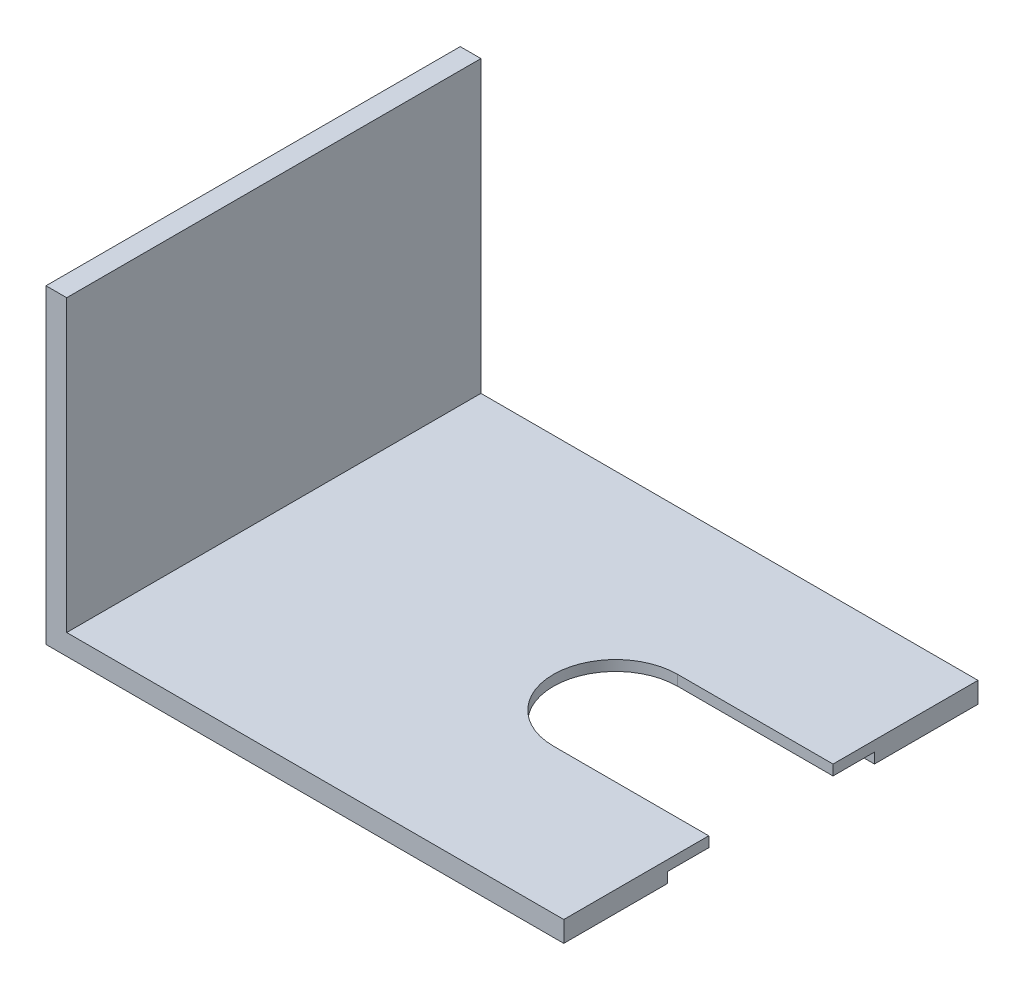
ISO-10303-21;
HEADER;
FILE_DESCRIPTION(('STEP AP214'),'2;1');
FILE_NAME('part.step','',(''),(''),'','','');
FILE_SCHEMA(('AUTOMOTIVE_DESIGN { 1 0 10303 214 1 1 1 1 }'));
ENDSEC;
DATA;
#1=APPLICATION_CONTEXT('core data for automotive mechanical design processes');
#2=APPLICATION_PROTOCOL_DEFINITION('international standard','automotive_design',2000,#1);
#3=PRODUCT_CONTEXT('',#1,'mechanical');
#4=PRODUCT('Part','Part','',(#3));
#5=PRODUCT_RELATED_PRODUCT_CATEGORY('part','',(#4));
#6=PRODUCT_DEFINITION_FORMATION('','',#4);
#7=PRODUCT_DEFINITION_CONTEXT('part definition',#1,'design');
#8=PRODUCT_DEFINITION('design','',#6,#7);
#9=PRODUCT_DEFINITION_SHAPE('','',#8);
#10=(LENGTH_UNIT() NAMED_UNIT(*) SI_UNIT(.MILLI.,.METRE.));
#11=(NAMED_UNIT(*) PLANE_ANGLE_UNIT() SI_UNIT($,.RADIAN.));
#12=(NAMED_UNIT(*) SI_UNIT($,.STERADIAN.) SOLID_ANGLE_UNIT());
#13=UNCERTAINTY_MEASURE_WITH_UNIT(LENGTH_MEASURE(1.E-05),#10,'distance_accuracy_value','');
#14=(GEOMETRIC_REPRESENTATION_CONTEXT(3) GLOBAL_UNCERTAINTY_ASSIGNED_CONTEXT((#13)) GLOBAL_UNIT_ASSIGNED_CONTEXT((#10,
#11,#12)) REPRESENTATION_CONTEXT('',''));
#15=CARTESIAN_POINT('',(0.,0.,0.));
#16=DIRECTION('',(0.,0.,1.));
#17=DIRECTION('',(1.,0.,0.));
#18=AXIS2_PLACEMENT_3D('',#15,#16,#17);
#19=CARTESIAN_POINT('',(50.,0.,40.));
#20=DIRECTION('',(0.,1.,0.));
#21=DIRECTION('',(-1.,0.,0.));
#22=AXIS2_PLACEMENT_3D('',#19,#20,#21);
#23=PLANE('',#22);
#24=DIRECTION('',(1.,0.,0.));
#25=VECTOR('',#24,1.);
#26=CARTESIAN_POINT('',(0.,0.,30.));
#27=LINE('',#26,#25);
#28=CARTESIAN_POINT('',(35.,0.,30.));
#29=VERTEX_POINT('',#28);
#30=CARTESIAN_POINT('',(50.,0.,30.));
#31=VERTEX_POINT('',#30);
#32=EDGE_CURVE('E141',#29,#31,#27,.T.);
#33=ORIENTED_EDGE('',*,*,#32,.T.);
#34=DIRECTION('',(0.,0.,-1.));
#35=VECTOR('',#34,1.);
#36=CARTESIAN_POINT('',(50.,0.,40.));
#37=LINE('',#36,#35);
#38=CARTESIAN_POINT('',(50.,0.,40.));
#39=VERTEX_POINT('',#38);
#40=EDGE_CURVE('E236',#39,#31,#37,.T.);
#41=ORIENTED_EDGE('',*,*,#40,.F.);
#42=DIRECTION('',(1.,0.,0.));
#43=VECTOR('',#42,1.);
#44=CARTESIAN_POINT('',(50.,0.,40.));
#45=LINE('',#44,#43);
#46=CARTESIAN_POINT('',(0.,0.,40.));
#47=VERTEX_POINT('',#46);
#48=EDGE_CURVE('E193',#47,#39,#45,.T.);
#49=ORIENTED_EDGE('',*,*,#48,.F.);
#50=DIRECTION('',(0.,0.,-1.));
#51=VECTOR('',#50,1.);
#52=CARTESIAN_POINT('',(0.,0.,40.));
#53=LINE('',#52,#51);
#54=CARTESIAN_POINT('',(0.,0.,0.));
#55=VERTEX_POINT('',#54);
#56=EDGE_CURVE('E207',#47,#55,#53,.T.);
#57=ORIENTED_EDGE('',*,*,#56,.T.);
#58=DIRECTION('',(1.,0.,0.));
#59=VECTOR('',#58,1.);
#60=CARTESIAN_POINT('',(50.,0.,0.));
#61=LINE('',#60,#59);
#62=CARTESIAN_POINT('',(50.,0.,0.));
#63=VERTEX_POINT('',#62);
#64=EDGE_CURVE('E186',#55,#63,#61,.T.);
#65=ORIENTED_EDGE('',*,*,#64,.T.);
#66=CARTESIAN_POINT('',(50.,0.,10.));
#67=VERTEX_POINT('',#66);
#68=EDGE_CURVE('E235',#67,#63,#37,.T.);
#69=ORIENTED_EDGE('',*,*,#68,.F.);
#70=DIRECTION('',(-0.999995604086498,0.,0.00296509825800977));
#71=VECTOR('',#70,1.);
#72=CARTESIAN_POINT('',(0.0300904426209256,0.,10.1481663431079));
#73=LINE('',#72,#71);
#74=CARTESIAN_POINT('',(34.0279213290114,0.,10.0473589908302));
#75=VERTEX_POINT('',#74);
#76=EDGE_CURVE('E155',#67,#75,#73,.T.);
#77=ORIENTED_EDGE('',*,*,#76,.T.);
#78=CARTESIAN_POINT('',(35.,0.,20.));
#79=DIRECTION('',(0.,-1.,0.));
#80=DIRECTION('',(1.,0.,0.));
#81=AXIS2_PLACEMENT_3D('',#78,#79,#80);
#82=CIRCLE('',#81,10.);
#83=EDGE_CURVE('E172',#29,#75,#82,.T.);
#84=ORIENTED_EDGE('',*,*,#83,.F.);
#85=EDGE_LOOP('',(#33,#41,#49,#57,#65,#69,#77,#84));
#86=FACE_BOUND('',#85,.T.);
#87=ADVANCED_FACE('F37',(#86),#23,.F.);
#88=CARTESIAN_POINT('',(50.,2.,40.));
#89=DIRECTION('',(-1.,0.,0.));
#90=DIRECTION('',(0.,0.,1.));
#91=AXIS2_PLACEMENT_3D('',#88,#89,#90);
#92=PLANE('',#91);
#93=DIRECTION('',(0.,-1.,0.));
#94=VECTOR('',#93,1.);
#95=CARTESIAN_POINT('',(50.,0.999999999999999,30.));
#96=LINE('',#95,#94);
#97=CARTESIAN_POINT('',(50.,0.999999999999999,30.));
#98=VERTEX_POINT('',#97);
#99=EDGE_CURVE('E176',#98,#31,#96,.T.);
#100=ORIENTED_EDGE('',*,*,#99,.F.);
#101=DIRECTION('',(0.,0.,1.));
#102=VECTOR('',#101,1.);
#103=CARTESIAN_POINT('',(50.,0.999999999999999,0.));
#104=LINE('',#103,#102);
#105=CARTESIAN_POINT('',(50.,0.999999999999999,26.));
#106=VERTEX_POINT('',#105);
#107=EDGE_CURVE('E147',#106,#98,#104,.T.);
#108=ORIENTED_EDGE('',*,*,#107,.F.);
#109=DIRECTION('',(0.,-1.,0.));
#110=VECTOR('',#109,1.);
#111=CARTESIAN_POINT('',(50.,30.,26.));
#112=LINE('',#111,#110);
#113=CARTESIAN_POINT('',(50.,2.,26.));
#114=VERTEX_POINT('',#113);
#115=EDGE_CURVE('E183',#114,#106,#112,.T.);
#116=ORIENTED_EDGE('',*,*,#115,.F.);
#117=DIRECTION('',(0.,0.,-1.));
#118=VECTOR('',#117,1.);
#119=CARTESIAN_POINT('',(50.,2.,40.));
#120=LINE('',#119,#118);
#121=CARTESIAN_POINT('',(50.,2.,40.));
#122=VERTEX_POINT('',#121);
#123=EDGE_CURVE('E232',#122,#114,#120,.T.);
#124=ORIENTED_EDGE('',*,*,#123,.F.);
#125=DIRECTION('',(0.,1.,0.));
#126=VECTOR('',#125,1.);
#127=CARTESIAN_POINT('',(50.,2.,40.));
#128=LINE('',#127,#126);
#129=EDGE_CURVE('E196',#39,#122,#128,.T.);
#130=ORIENTED_EDGE('',*,*,#129,.F.);
#131=ORIENTED_EDGE('',*,*,#40,.T.);
#132=EDGE_LOOP('',(#100,#108,#116,#124,#130,#131));
#133=FACE_BOUND('',#132,.T.);
#134=ADVANCED_FACE('F271',(#133),#92,.F.);
#135=DIRECTION('',(0.,-1.,0.));
#136=VECTOR('',#135,1.);
#137=CARTESIAN_POINT('',(50.,0.999999999999999,10.));
#138=LINE('',#137,#136);
#139=CARTESIAN_POINT('',(50.,0.999999999999999,10.));
#140=VERTEX_POINT('',#139);
#141=EDGE_CURVE('E179',#140,#67,#138,.T.);
#142=ORIENTED_EDGE('',*,*,#141,.T.);
#143=ORIENTED_EDGE('',*,*,#68,.T.);
#144=DIRECTION('',(0.,1.,0.));
#145=VECTOR('',#144,1.);
#146=CARTESIAN_POINT('',(50.,2.,0.));
#147=LINE('',#146,#145);
#148=CARTESIAN_POINT('',(50.,2.,0.));
#149=VERTEX_POINT('',#148);
#150=EDGE_CURVE('E210',#63,#149,#147,.T.);
#151=ORIENTED_EDGE('',*,*,#150,.T.);
#152=CARTESIAN_POINT('',(50.,2.,14.));
#153=VERTEX_POINT('',#152);
#154=EDGE_CURVE('E231',#153,#149,#120,.T.);
#155=ORIENTED_EDGE('',*,*,#154,.F.);
#156=DIRECTION('',(0.,-1.,0.));
#157=VECTOR('',#156,1.);
#158=CARTESIAN_POINT('',(50.,30.,14.));
#159=LINE('',#158,#157);
#160=CARTESIAN_POINT('',(50.,0.999999999999999,14.));
#161=VERTEX_POINT('',#160);
#162=EDGE_CURVE('E187',#153,#161,#159,.T.);
#163=ORIENTED_EDGE('',*,*,#162,.T.);
#164=DIRECTION('',(0.,0.,1.));
#165=VECTOR('',#164,1.);
#166=CARTESIAN_POINT('',(50.,0.999999999999999,0.));
#167=LINE('',#166,#165);
#168=EDGE_CURVE('E161',#140,#161,#167,.T.);
#169=ORIENTED_EDGE('',*,*,#168,.F.);
#170=EDGE_LOOP('',(#142,#143,#151,#155,#163,#169));
#171=FACE_BOUND('',#170,.T.);
#172=ADVANCED_FACE('F248',(#171),#92,.F.);
#173=CARTESIAN_POINT('',(0.,30.,26.));
#174=DIRECTION('',(0.,0.,-1.));
#175=DIRECTION('',(-1.,0.,0.));
#176=AXIS2_PLACEMENT_3D('',#173,#174,#175);
#177=PLANE('',#176);
#178=ORIENTED_EDGE('',*,*,#115,.T.);
#179=DIRECTION('',(1.,0.,0.));
#180=VECTOR('',#179,1.);
#181=CARTESIAN_POINT('',(0.,1.,26.));
#182=LINE('',#181,#180);
#183=CARTESIAN_POINT('',(35.,0.999999999999999,26.));
#184=VERTEX_POINT('',#183);
#185=EDGE_CURVE('E168',#184,#106,#182,.T.);
#186=ORIENTED_EDGE('',*,*,#185,.F.);
#187=DIRECTION('',(0.,-1.,0.));
#188=VECTOR('',#187,1.);
#189=CARTESIAN_POINT('',(35.,30.,26.));
#190=LINE('',#189,#188);
#191=CARTESIAN_POINT('',(35.,2.,26.));
#192=VERTEX_POINT('',#191);
#193=EDGE_CURVE('E178',#192,#184,#190,.T.);
#194=ORIENTED_EDGE('',*,*,#193,.F.);
#195=DIRECTION('',(1.,0.,0.));
#196=VECTOR('',#195,1.);
#197=CARTESIAN_POINT('',(2.,2.,26.));
#198=LINE('',#197,#196);
#199=EDGE_CURVE('E11',#192,#114,#198,.T.);
#200=ORIENTED_EDGE('',*,*,#199,.T.);
#201=EDGE_LOOP('',(#178,#186,#194,#200));
#202=FACE_BOUND('',#201,.T.);
#203=ADVANCED_FACE('F274',(#202),#177,.T.);
#204=CARTESIAN_POINT('',(0.,30.,14.));
#205=DIRECTION('',(0.,0.,-1.));
#206=DIRECTION('',(-1.,0.,0.));
#207=AXIS2_PLACEMENT_3D('',#204,#205,#206);
#208=PLANE('',#207);
#209=DIRECTION('',(-1.,0.,0.));
#210=VECTOR('',#209,1.);
#211=CARTESIAN_POINT('',(0.,1.,14.));
#212=LINE('',#211,#210);
#213=CARTESIAN_POINT('',(35.,1.,14.));
#214=VERTEX_POINT('',#213);
#215=EDGE_CURVE('E51',#161,#214,#212,.T.);
#216=ORIENTED_EDGE('',*,*,#215,.F.);
#217=ORIENTED_EDGE('',*,*,#162,.F.);
#218=DIRECTION('',(1.,0.,0.));
#219=VECTOR('',#218,1.);
#220=CARTESIAN_POINT('',(2.,2.,14.));
#221=LINE('',#220,#219);
#222=CARTESIAN_POINT('',(35.,2.,14.));
#223=VERTEX_POINT('',#222);
#224=EDGE_CURVE('E44',#223,#153,#221,.T.);
#225=ORIENTED_EDGE('',*,*,#224,.F.);
#226=DIRECTION('',(0.,-1.,0.));
#227=VECTOR('',#226,1.);
#228=CARTESIAN_POINT('',(35.,30.,14.));
#229=LINE('',#228,#227);
#230=EDGE_CURVE('E58',#223,#214,#229,.T.);
#231=ORIENTED_EDGE('',*,*,#230,.T.);
#232=EDGE_LOOP('',(#216,#217,#225,#231));
#233=FACE_BOUND('',#232,.T.);
#234=ADVANCED_FACE('F277',(#233),#208,.F.);
#235=CARTESIAN_POINT('',(35.,30.,20.));
#236=DIRECTION('',(0.,-1.,0.));
#237=DIRECTION('',(1.,0.,0.));
#238=AXIS2_PLACEMENT_3D('',#235,#236,#237);
#239=CYLINDRICAL_SURFACE('',#238,6.);
#240=CARTESIAN_POINT('',(35.,0.999999999999999,20.));
#241=DIRECTION('',(0.,-1.,0.));
#242=DIRECTION('',(1.,0.,0.));
#243=AXIS2_PLACEMENT_3D('',#240,#241,#242);
#244=CIRCLE('',#243,6.);
#245=EDGE_CURVE('E166',#214,#184,#244,.F.);
#246=ORIENTED_EDGE('',*,*,#245,.F.);
#247=ORIENTED_EDGE('',*,*,#230,.F.);
#248=CARTESIAN_POINT('',(35.,2.,20.));
#249=DIRECTION('',(0.,-1.,0.));
#250=DIRECTION('',(0.,0.,-1.));
#251=AXIS2_PLACEMENT_3D('',#248,#249,#250);
#252=CIRCLE('',#251,6.);
#253=EDGE_CURVE('E239',#192,#223,#252,.T.);
#254=ORIENTED_EDGE('',*,*,#253,.F.);
#255=ORIENTED_EDGE('',*,*,#193,.T.);
#256=EDGE_LOOP('',(#246,#247,#254,#255));
#257=FACE_BOUND('',#256,.T.);
#258=ADVANCED_FACE('F276',(#257),#239,.F.);
#259=CARTESIAN_POINT('',(2.,2.,40.));
#260=DIRECTION('',(0.,-1.,0.));
#261=DIRECTION('',(0.,0.,-1.));
#262=AXIS2_PLACEMENT_3D('',#259,#260,#261);
#263=PLANE('',#262);
#264=ORIENTED_EDGE('',*,*,#199,.F.);
#265=ORIENTED_EDGE('',*,*,#253,.T.);
#266=ORIENTED_EDGE('',*,*,#224,.T.);
#267=ORIENTED_EDGE('',*,*,#154,.T.);
#268=DIRECTION('',(-1.,0.,0.));
#269=VECTOR('',#268,1.);
#270=CARTESIAN_POINT('',(2.,2.,0.));
#271=LINE('',#270,#269);
#272=CARTESIAN_POINT('',(2.,2.,0.));
#273=VERTEX_POINT('',#272);
#274=EDGE_CURVE('E213',#149,#273,#271,.T.);
#275=ORIENTED_EDGE('',*,*,#274,.T.);
#276=DIRECTION('',(0.,0.,-1.));
#277=VECTOR('',#276,1.);
#278=CARTESIAN_POINT('',(2.,2.,40.));
#279=LINE('',#278,#277);
#280=CARTESIAN_POINT('',(2.,2.,40.));
#281=VERTEX_POINT('',#280);
#282=EDGE_CURVE('E228',#281,#273,#279,.T.);
#283=ORIENTED_EDGE('',*,*,#282,.F.);
#284=DIRECTION('',(-1.,0.,0.));
#285=VECTOR('',#284,1.);
#286=CARTESIAN_POINT('',(2.,2.,40.));
#287=LINE('',#286,#285);
#288=EDGE_CURVE('E199',#122,#281,#287,.T.);
#289=ORIENTED_EDGE('',*,*,#288,.F.);
#290=ORIENTED_EDGE('',*,*,#123,.T.);
#291=EDGE_LOOP('',(#264,#265,#266,#267,#275,#283,#289,#290));
#292=FACE_BOUND('',#291,.T.);
#293=ADVANCED_FACE('F245',(#292),#263,.F.);
#294=CARTESIAN_POINT('',(2.,30.,40.));
#295=DIRECTION('',(-1.,0.,0.));
#296=DIRECTION('',(0.,0.,1.));
#297=AXIS2_PLACEMENT_3D('',#294,#295,#296);
#298=PLANE('',#297);
#299=DIRECTION('',(0.,1.,0.));
#300=VECTOR('',#299,1.);
#301=CARTESIAN_POINT('',(2.,30.,0.));
#302=LINE('',#301,#300);
#303=CARTESIAN_POINT('',(2.,30.,0.));
#304=VERTEX_POINT('',#303);
#305=EDGE_CURVE('E215',#273,#304,#302,.T.);
#306=ORIENTED_EDGE('',*,*,#305,.T.);
#307=DIRECTION('',(0.,0.,-1.));
#308=VECTOR('',#307,1.);
#309=CARTESIAN_POINT('',(2.,30.,40.));
#310=LINE('',#309,#308);
#311=CARTESIAN_POINT('',(2.,30.,40.));
#312=VERTEX_POINT('',#311);
#313=EDGE_CURVE('E225',#312,#304,#310,.T.);
#314=ORIENTED_EDGE('',*,*,#313,.F.);
#315=DIRECTION('',(0.,1.,0.));
#316=VECTOR('',#315,1.);
#317=CARTESIAN_POINT('',(2.,30.,40.));
#318=LINE('',#317,#316);
#319=EDGE_CURVE('E201',#281,#312,#318,.T.);
#320=ORIENTED_EDGE('',*,*,#319,.F.);
#321=ORIENTED_EDGE('',*,*,#282,.T.);
#322=EDGE_LOOP('',(#306,#314,#320,#321));
#323=FACE_BOUND('',#322,.T.);
#324=ADVANCED_FACE('F262',(#323),#298,.F.);
#325=CARTESIAN_POINT('',(0.,30.,40.));
#326=DIRECTION('',(0.,-1.,0.));
#327=DIRECTION('',(0.,0.,-1.));
#328=AXIS2_PLACEMENT_3D('',#325,#326,#327);
#329=PLANE('',#328);
#330=DIRECTION('',(-1.,0.,0.));
#331=VECTOR('',#330,1.);
#332=CARTESIAN_POINT('',(0.,30.,0.));
#333=LINE('',#332,#331);
#334=CARTESIAN_POINT('',(0.,30.,0.));
#335=VERTEX_POINT('',#334);
#336=EDGE_CURVE('E217',#304,#335,#333,.T.);
#337=ORIENTED_EDGE('',*,*,#336,.T.);
#338=DIRECTION('',(0.,0.,-1.));
#339=VECTOR('',#338,1.);
#340=CARTESIAN_POINT('',(0.,30.,40.));
#341=LINE('',#340,#339);
#342=CARTESIAN_POINT('',(0.,30.,40.));
#343=VERTEX_POINT('',#342);
#344=EDGE_CURVE('E222',#343,#335,#341,.T.);
#345=ORIENTED_EDGE('',*,*,#344,.F.);
#346=DIRECTION('',(-1.,0.,0.));
#347=VECTOR('',#346,1.);
#348=CARTESIAN_POINT('',(0.,30.,40.));
#349=LINE('',#348,#347);
#350=EDGE_CURVE('E203',#312,#343,#349,.T.);
#351=ORIENTED_EDGE('',*,*,#350,.F.);
#352=ORIENTED_EDGE('',*,*,#313,.T.);
#353=EDGE_LOOP('',(#337,#345,#351,#352));
#354=FACE_BOUND('',#353,.T.);
#355=ADVANCED_FACE('F390',(#354),#329,.F.);
#356=CARTESIAN_POINT('',(0.,0.,40.));
#357=DIRECTION('',(1.,0.,0.));
#358=DIRECTION('',(0.,0.,-1.));
#359=AXIS2_PLACEMENT_3D('',#356,#357,#358);
#360=PLANE('',#359);
#361=DIRECTION('',(0.,-1.,0.));
#362=VECTOR('',#361,1.);
#363=CARTESIAN_POINT('',(0.,0.,0.));
#364=LINE('',#363,#362);
#365=EDGE_CURVE('E197',#335,#55,#364,.T.);
#366=ORIENTED_EDGE('',*,*,#365,.T.);
#367=ORIENTED_EDGE('',*,*,#56,.F.);
#368=DIRECTION('',(0.,-1.,0.));
#369=VECTOR('',#368,1.);
#370=CARTESIAN_POINT('',(0.,0.,40.));
#371=LINE('',#370,#369);
#372=EDGE_CURVE('E205',#343,#47,#371,.T.);
#373=ORIENTED_EDGE('',*,*,#372,.F.);
#374=ORIENTED_EDGE('',*,*,#344,.T.);
#375=EDGE_LOOP('',(#366,#367,#373,#374));
#376=FACE_BOUND('',#375,.T.);
#377=ADVANCED_FACE('F381',(#376),#360,.F.);
#378=CARTESIAN_POINT('',(0.,0.,40.));
#379=DIRECTION('',(0.,0.,-1.));
#380=DIRECTION('',(-1.,0.,0.));
#381=AXIS2_PLACEMENT_3D('',#378,#379,#380);
#382=PLANE('',#381);
#383=ORIENTED_EDGE('',*,*,#48,.T.);
#384=ORIENTED_EDGE('',*,*,#129,.T.);
#385=ORIENTED_EDGE('',*,*,#288,.T.);
#386=ORIENTED_EDGE('',*,*,#319,.T.);
#387=ORIENTED_EDGE('',*,*,#350,.T.);
#388=ORIENTED_EDGE('',*,*,#372,.T.);
#389=EDGE_LOOP('',(#383,#384,#385,#386,#387,#388));
#390=FACE_BOUND('',#389,.T.);
#391=ADVANCED_FACE('F266',(#390),#382,.F.);
#392=CARTESIAN_POINT('',(0.,0.,0.));
#393=DIRECTION('',(0.,0.,-1.));
#394=DIRECTION('',(-1.,0.,0.));
#395=AXIS2_PLACEMENT_3D('',#392,#393,#394);
#396=PLANE('',#395);
#397=ORIENTED_EDGE('',*,*,#64,.F.);
#398=ORIENTED_EDGE('',*,*,#365,.F.);
#399=ORIENTED_EDGE('',*,*,#336,.F.);
#400=ORIENTED_EDGE('',*,*,#305,.F.);
#401=ORIENTED_EDGE('',*,*,#274,.F.);
#402=ORIENTED_EDGE('',*,*,#150,.F.);
#403=EDGE_LOOP('',(#397,#398,#399,#400,#401,#402));
#404=FACE_BOUND('',#403,.T.);
#405=ADVANCED_FACE('F256',(#404),#396,.T.);
#406=CARTESIAN_POINT('',(0.,1.,30.));
#407=DIRECTION('',(0.,0.,-1.));
#408=DIRECTION('',(-1.,0.,0.));
#409=AXIS2_PLACEMENT_3D('',#406,#407,#408);
#410=PLANE('',#409);
#411=ORIENTED_EDGE('',*,*,#32,.F.);
#412=DIRECTION('',(0.,-1.,0.));
#413=VECTOR('',#412,1.);
#414=CARTESIAN_POINT('',(35.,0.999999999999999,30.));
#415=LINE('',#414,#413);
#416=CARTESIAN_POINT('',(35.,0.999999999999999,30.));
#417=VERTEX_POINT('',#416);
#418=EDGE_CURVE('E135',#417,#29,#415,.T.);
#419=ORIENTED_EDGE('',*,*,#418,.F.);
#420=DIRECTION('',(1.,0.,0.));
#421=VECTOR('',#420,1.);
#422=CARTESIAN_POINT('',(0.,1.,30.));
#423=LINE('',#422,#421);
#424=EDGE_CURVE('E138',#417,#98,#423,.T.);
#425=ORIENTED_EDGE('',*,*,#424,.T.);
#426=ORIENTED_EDGE('',*,*,#99,.T.);
#427=EDGE_LOOP('',(#411,#419,#425,#426));
#428=FACE_BOUND('',#427,.T.);
#429=ADVANCED_FACE('F137',(#428),#410,.T.);
#430=CARTESIAN_POINT('',(0.0300904426209256,1.,10.1481663431079));
#431=DIRECTION('',(0.00296509825800977,0.,0.999995604086498));
#432=DIRECTION('',(0.999995604086498,0.,-0.00296509825800977));
#433=AXIS2_PLACEMENT_3D('',#430,#431,#432);
#434=PLANE('',#433);
#435=ORIENTED_EDGE('',*,*,#76,.F.);
#436=ORIENTED_EDGE('',*,*,#141,.F.);
#437=DIRECTION('',(-0.999995604086498,0.,0.00296509825800977));
#438=VECTOR('',#437,1.);
#439=CARTESIAN_POINT('',(0.0300904426209256,1.,10.1481663431079));
#440=LINE('',#439,#438);
#441=CARTESIAN_POINT('',(34.0279213290114,0.999999999999999,10.0473589908302));
#442=VERTEX_POINT('',#441);
#443=EDGE_CURVE('E159',#140,#442,#440,.T.);
#444=ORIENTED_EDGE('',*,*,#443,.T.);
#445=DIRECTION('',(0.,-1.,0.));
#446=VECTOR('',#445,1.);
#447=CARTESIAN_POINT('',(34.0279213290114,0.999999999999999,10.0473589908302));
#448=LINE('',#447,#446);
#449=EDGE_CURVE('E146',#442,#75,#448,.T.);
#450=ORIENTED_EDGE('',*,*,#449,.T.);
#451=EDGE_LOOP('',(#435,#436,#444,#450));
#452=FACE_BOUND('',#451,.T.);
#453=ADVANCED_FACE('F295',(#452),#434,.T.);
#454=CARTESIAN_POINT('',(35.,0.999999999999999,20.));
#455=DIRECTION('',(0.,-1.,0.));
#456=DIRECTION('',(1.,0.,0.));
#457=AXIS2_PLACEMENT_3D('',#454,#455,#456);
#458=CYLINDRICAL_SURFACE('',#457,10.);
#459=ORIENTED_EDGE('',*,*,#83,.T.);
#460=ORIENTED_EDGE('',*,*,#449,.F.);
#461=CARTESIAN_POINT('',(35.,0.999999999999999,20.));
#462=DIRECTION('',(0.,-1.,0.));
#463=DIRECTION('',(1.,0.,0.));
#464=AXIS2_PLACEMENT_3D('',#461,#462,#463);
#465=CIRCLE('',#464,10.);
#466=EDGE_CURVE('E152',#417,#442,#465,.T.);
#467=ORIENTED_EDGE('',*,*,#466,.F.);
#468=ORIENTED_EDGE('',*,*,#418,.T.);
#469=EDGE_LOOP('',(#459,#460,#467,#468));
#470=FACE_BOUND('',#469,.T.);
#471=ADVANCED_FACE('F158',(#470),#458,.F.);
#472=CARTESIAN_POINT('',(0.,1.,0.));
#473=DIRECTION('',(0.,-1.,0.));
#474=DIRECTION('',(1.,0.,0.));
#475=AXIS2_PLACEMENT_3D('',#472,#473,#474);
#476=PLANE('',#475);
#477=ORIENTED_EDGE('',*,*,#424,.F.);
#478=ORIENTED_EDGE('',*,*,#466,.T.);
#479=ORIENTED_EDGE('',*,*,#443,.F.);
#480=ORIENTED_EDGE('',*,*,#168,.T.);
#481=ORIENTED_EDGE('',*,*,#215,.T.);
#482=ORIENTED_EDGE('',*,*,#245,.T.);
#483=ORIENTED_EDGE('',*,*,#185,.T.);
#484=ORIENTED_EDGE('',*,*,#107,.T.);
#485=EDGE_LOOP('',(#477,#478,#479,#480,#481,#482,#483,#484));
#486=FACE_BOUND('',#485,.T.);
#487=ADVANCED_FACE('F150',(#486),#476,.T.);
#488=CLOSED_SHELL('',(#87,#134,#172,#203,#234,#258,#293,#324,#355,#377,#391,#405,#429,#453,#471,#487));
#489=MANIFOLD_SOLID_BREP('B2',#488);
#490=ADVANCED_BREP_SHAPE_REPRESENTATION('',(#18,#489),#14);
#491=SHAPE_DEFINITION_REPRESENTATION(#9,#490);
ENDSEC;
END-ISO-10303-21;
